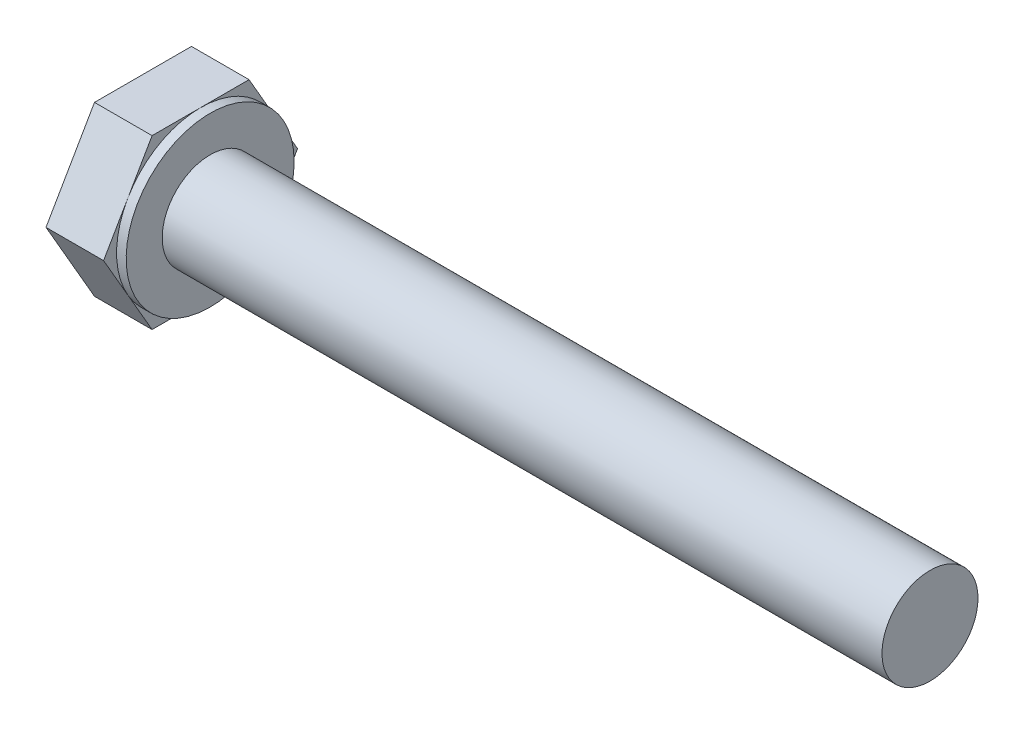
ISO-10303-21;
HEADER;
FILE_DESCRIPTION(('STEP AP214'),'2;1');
FILE_NAME('part.step','',(''),(''),'','','');
FILE_SCHEMA(('AUTOMOTIVE_DESIGN { 1 0 10303 214 1 1 1 1 }'));
ENDSEC;
DATA;
#1=APPLICATION_CONTEXT('core data for automotive mechanical design processes');
#2=APPLICATION_PROTOCOL_DEFINITION('international standard','automotive_design',2000,#1);
#3=PRODUCT_CONTEXT('',#1,'mechanical');
#4=PRODUCT('Part','Part','',(#3));
#5=PRODUCT_RELATED_PRODUCT_CATEGORY('part','',(#4));
#6=PRODUCT_DEFINITION_FORMATION('','',#4);
#7=PRODUCT_DEFINITION_CONTEXT('part definition',#1,'design');
#8=PRODUCT_DEFINITION('design','',#6,#7);
#9=PRODUCT_DEFINITION_SHAPE('','',#8);
#10=(LENGTH_UNIT() NAMED_UNIT(*) SI_UNIT(.MILLI.,.METRE.));
#11=(NAMED_UNIT(*) PLANE_ANGLE_UNIT() SI_UNIT($,.RADIAN.));
#12=(NAMED_UNIT(*) SI_UNIT($,.STERADIAN.) SOLID_ANGLE_UNIT());
#13=UNCERTAINTY_MEASURE_WITH_UNIT(LENGTH_MEASURE(1.E-05),#10,'distance_accuracy_value','');
#14=(GEOMETRIC_REPRESENTATION_CONTEXT(3) GLOBAL_UNCERTAINTY_ASSIGNED_CONTEXT((#13)) GLOBAL_UNIT_ASSIGNED_CONTEXT((#10,
#11,#12)) REPRESENTATION_CONTEXT('',''));
#15=CARTESIAN_POINT('',(0.,0.,0.));
#16=DIRECTION('',(0.,0.,1.));
#17=DIRECTION('',(1.,0.,0.));
#18=AXIS2_PLACEMENT_3D('',#15,#16,#17);
#19=CARTESIAN_POINT('',(0.4,0.,0.));
#20=DIRECTION('',(1.,0.,0.));
#21=DIRECTION('',(0.,0.,-1.));
#22=AXIS2_PLACEMENT_3D('',#19,#20,#21);
#23=PLANE('',#22);
#24=CARTESIAN_POINT('',(0.4,0.,0.));
#25=DIRECTION('',(1.,0.,0.));
#26=DIRECTION('',(0.,0.,-1.));
#27=AXIS2_PLACEMENT_3D('',#24,#25,#26);
#28=CIRCLE('',#27,3.5);
#29=CARTESIAN_POINT('',(0.4,0.,-3.5));
#30=VERTEX_POINT('',#29);
#31=EDGE_CURVE('E126',#30,#30,#28,.T.);
#32=ORIENTED_EDGE('',*,*,#31,.T.);
#33=EDGE_LOOP('',(#32));
#34=FACE_BOUND('',#33,.T.);
#35=CARTESIAN_POINT('',(0.4,0.,0.));
#36=DIRECTION('',(1.,0.,0.));
#37=DIRECTION('',(0.,0.,-1.));
#38=AXIS2_PLACEMENT_3D('',#35,#36,#37);
#39=CIRCLE('',#38,2.);
#40=CARTESIAN_POINT('',(0.4,0.,-2.));
#41=VERTEX_POINT('',#40);
#42=EDGE_CURVE('E349',#41,#41,#39,.T.);
#43=ORIENTED_EDGE('',*,*,#42,.F.);
#44=EDGE_LOOP('',(#43));
#45=FACE_BOUND('',#44,.T.);
#46=ADVANCED_FACE('F33',(#34,#45),#23,.T.);
#47=CARTESIAN_POINT('',(0.,0.,0.));
#48=DIRECTION('',(1.,0.,0.));
#49=DIRECTION('',(0.,0.,-1.));
#50=AXIS2_PLACEMENT_3D('',#47,#48,#49);
#51=PLANE('',#50);
#52=CARTESIAN_POINT('',(0.,0.,0.));
#53=DIRECTION('',(1.,0.,0.));
#54=DIRECTION('',(0.,0.,-1.));
#55=AXIS2_PLACEMENT_3D('',#52,#53,#54);
#56=CIRCLE('',#55,3.5);
#57=CARTESIAN_POINT('',(0.,1.75,-3.03108891324554));
#58=VERTEX_POINT('',#57);
#59=CARTESIAN_POINT('',(0.,3.5,0.));
#60=VERTEX_POINT('',#59);
#61=EDGE_CURVE('E44',#58,#60,#56,.T.);
#62=ORIENTED_EDGE('',*,*,#61,.F.);
#63=DIRECTION('',(0.,0.866025403784439,0.5));
#64=VECTOR('',#63,1.);
#65=CARTESIAN_POINT('',(0.,0.,-4.04145188432738));
#66=LINE('',#65,#64);
#67=CARTESIAN_POINT('',(0.,3.5,-2.02072594216369));
#68=VERTEX_POINT('',#67);
#69=EDGE_CURVE('E111',#58,#68,#66,.T.);
#70=ORIENTED_EDGE('',*,*,#69,.T.);
#71=DIRECTION('',(0.,0.,1.));
#72=VECTOR('',#71,1.);
#73=CARTESIAN_POINT('',(0.,3.5,-2.02072594216369));
#74=LINE('',#73,#72);
#75=EDGE_CURVE('E124',#68,#60,#74,.T.);
#76=ORIENTED_EDGE('',*,*,#75,.T.);
#77=EDGE_LOOP('',(#62,#70,#76));
#78=FACE_BOUND('',#77,.T.);
#79=ADVANCED_FACE('F123',(#78),#51,.T.);
#80=CARTESIAN_POINT('',(0.,1.75,3.03108891324554));
#81=VERTEX_POINT('',#80);
#82=EDGE_CURVE('E11',#60,#81,#56,.T.);
#83=ORIENTED_EDGE('',*,*,#82,.F.);
#84=CARTESIAN_POINT('',(0.,3.5,2.02072594216369));
#85=VERTEX_POINT('',#84);
#86=EDGE_CURVE('E110',#60,#85,#74,.T.);
#87=ORIENTED_EDGE('',*,*,#86,.T.);
#88=DIRECTION('',(0.,-0.866025403784439,0.5));
#89=VECTOR('',#88,1.);
#90=CARTESIAN_POINT('',(0.,3.5,2.02072594216369));
#91=LINE('',#90,#89);
#92=EDGE_CURVE('E156',#85,#81,#91,.T.);
#93=ORIENTED_EDGE('',*,*,#92,.T.);
#94=EDGE_LOOP('',(#83,#87,#93));
#95=FACE_BOUND('',#94,.T.);
#96=ADVANCED_FACE('F209',(#95),#51,.T.);
#97=CARTESIAN_POINT('',(0.,-1.75,3.03108891324554));
#98=VERTEX_POINT('',#97);
#99=EDGE_CURVE('E42',#81,#98,#56,.T.);
#100=ORIENTED_EDGE('',*,*,#99,.F.);
#101=CARTESIAN_POINT('',(0.,0.,4.04145188432738));
#102=VERTEX_POINT('',#101);
#103=EDGE_CURVE('E159',#81,#102,#91,.T.);
#104=ORIENTED_EDGE('',*,*,#103,.T.);
#105=DIRECTION('',(0.,-0.866025403784439,-0.5));
#106=VECTOR('',#105,1.);
#107=CARTESIAN_POINT('',(0.,0.,4.04145188432738));
#108=LINE('',#107,#106);
#109=EDGE_CURVE('E160',#102,#98,#108,.T.);
#110=ORIENTED_EDGE('',*,*,#109,.T.);
#111=EDGE_LOOP('',(#100,#104,#110));
#112=FACE_BOUND('',#111,.T.);
#113=ADVANCED_FACE('F190',(#112),#51,.T.);
#114=CARTESIAN_POINT('',(0.,-3.5,0.));
#115=VERTEX_POINT('',#114);
#116=EDGE_CURVE('E133',#98,#115,#56,.T.);
#117=ORIENTED_EDGE('',*,*,#116,.F.);
#118=CARTESIAN_POINT('',(0.,-3.5,2.02072594216369));
#119=VERTEX_POINT('',#118);
#120=EDGE_CURVE('E158',#98,#119,#108,.T.);
#121=ORIENTED_EDGE('',*,*,#120,.T.);
#122=DIRECTION('',(0.,0.,-1.));
#123=VECTOR('',#122,1.);
#124=CARTESIAN_POINT('',(0.,-3.5,2.02072594216369));
#125=LINE('',#124,#123);
#126=EDGE_CURVE('E164',#119,#115,#125,.T.);
#127=ORIENTED_EDGE('',*,*,#126,.T.);
#128=EDGE_LOOP('',(#117,#121,#127));
#129=FACE_BOUND('',#128,.T.);
#130=ADVANCED_FACE('F192',(#129),#51,.T.);
#131=CARTESIAN_POINT('',(0.,-1.75,-3.03108891324553));
#132=VERTEX_POINT('',#131);
#133=EDGE_CURVE('E131',#115,#132,#56,.T.);
#134=ORIENTED_EDGE('',*,*,#133,.F.);
#135=CARTESIAN_POINT('',(0.,-3.5,-2.02072594216369));
#136=VERTEX_POINT('',#135);
#137=EDGE_CURVE('E163',#115,#136,#125,.T.);
#138=ORIENTED_EDGE('',*,*,#137,.T.);
#139=DIRECTION('',(0.,0.866025403784439,-0.5));
#140=VECTOR('',#139,1.);
#141=CARTESIAN_POINT('',(0.,-3.5,-2.02072594216369));
#142=LINE('',#141,#140);
#143=EDGE_CURVE('E121',#136,#132,#142,.T.);
#144=ORIENTED_EDGE('',*,*,#143,.T.);
#145=EDGE_LOOP('',(#134,#138,#144));
#146=FACE_BOUND('',#145,.T.);
#147=ADVANCED_FACE('F199',(#146),#51,.T.);
#148=CARTESIAN_POINT('',(-2.4,3.5,2.02072594216369));
#149=DIRECTION('',(0.,0.5,0.866025403784439));
#150=DIRECTION('',(0.,-0.866025403784439,0.5));
#151=AXIS2_PLACEMENT_3D('',#148,#149,#150);
#152=PLANE('',#151);
#153=ORIENTED_EDGE('',*,*,#92,.F.);
#154=DIRECTION('',(1.,0.,0.));
#155=VECTOR('',#154,1.);
#156=CARTESIAN_POINT('',(-2.4,3.5,2.02072594216369));
#157=LINE('',#156,#155);
#158=CARTESIAN_POINT('',(-2.4,3.5,2.02072594216369));
#159=VERTEX_POINT('',#158);
#160=EDGE_CURVE('E132',#159,#85,#157,.T.);
#161=ORIENTED_EDGE('',*,*,#160,.F.);
#162=DIRECTION('',(0.,-0.866025403784439,0.5));
#163=VECTOR('',#162,1.);
#164=CARTESIAN_POINT('',(-2.4,3.5,2.02072594216369));
#165=LINE('',#164,#163);
#166=CARTESIAN_POINT('',(-2.4,0.,4.04145188432738));
#167=VERTEX_POINT('',#166);
#168=EDGE_CURVE('E139',#159,#167,#165,.T.);
#169=ORIENTED_EDGE('',*,*,#168,.T.);
#170=DIRECTION('',(1.,0.,0.));
#171=VECTOR('',#170,1.);
#172=CARTESIAN_POINT('',(-2.4,0.,4.04145188432738));
#173=LINE('',#172,#171);
#174=EDGE_CURVE('E37',#167,#102,#173,.T.);
#175=ORIENTED_EDGE('',*,*,#174,.T.);
#176=ORIENTED_EDGE('',*,*,#103,.F.);
#177=EDGE_LOOP('',(#153,#161,#169,#175,#176));
#178=FACE_BOUND('',#177,.T.);
#179=ADVANCED_FACE('F35',(#178),#152,.T.);
#180=CARTESIAN_POINT('',(-2.4,3.5,-2.02072594216369));
#181=DIRECTION('',(0.,1.,0.));
#182=DIRECTION('',(0.,0.,1.));
#183=AXIS2_PLACEMENT_3D('',#180,#181,#182);
#184=PLANE('',#183);
#185=ORIENTED_EDGE('',*,*,#75,.F.);
#186=DIRECTION('',(1.,0.,0.));
#187=VECTOR('',#186,1.);
#188=CARTESIAN_POINT('',(-2.4,3.5,-2.02072594216369));
#189=LINE('',#188,#187);
#190=CARTESIAN_POINT('',(-2.4,3.5,-2.02072594216369));
#191=VERTEX_POINT('',#190);
#192=EDGE_CURVE('E117',#191,#68,#189,.T.);
#193=ORIENTED_EDGE('',*,*,#192,.F.);
#194=DIRECTION('',(0.,0.,1.));
#195=VECTOR('',#194,1.);
#196=CARTESIAN_POINT('',(-2.4,3.5,-2.02072594216369));
#197=LINE('',#196,#195);
#198=EDGE_CURVE('E153',#191,#159,#197,.T.);
#199=ORIENTED_EDGE('',*,*,#198,.T.);
#200=ORIENTED_EDGE('',*,*,#160,.T.);
#201=ORIENTED_EDGE('',*,*,#86,.F.);
#202=EDGE_LOOP('',(#185,#193,#199,#200,#201));
#203=FACE_BOUND('',#202,.T.);
#204=ADVANCED_FACE('F208',(#203),#184,.T.);
#205=CARTESIAN_POINT('',(-2.4,0.,-4.04145188432738));
#206=DIRECTION('',(0.,0.5,-0.866025403784439));
#207=DIRECTION('',(0.,0.866025403784439,0.5));
#208=AXIS2_PLACEMENT_3D('',#205,#206,#207);
#209=PLANE('',#208);
#210=CARTESIAN_POINT('',(0.,0.,-4.04145188432738));
#211=VERTEX_POINT('',#210);
#212=EDGE_CURVE('E104',#211,#58,#66,.T.);
#213=ORIENTED_EDGE('',*,*,#212,.F.);
#214=DIRECTION('',(1.,0.,0.));
#215=VECTOR('',#214,1.);
#216=CARTESIAN_POINT('',(-2.4,0.,-4.04145188432738));
#217=LINE('',#216,#215);
#218=CARTESIAN_POINT('',(-2.4,0.,-4.04145188432738));
#219=VERTEX_POINT('',#218);
#220=EDGE_CURVE('E171',#219,#211,#217,.T.);
#221=ORIENTED_EDGE('',*,*,#220,.F.);
#222=DIRECTION('',(0.,0.866025403784439,0.5));
#223=VECTOR('',#222,1.);
#224=CARTESIAN_POINT('',(-2.4,0.,-4.04145188432738));
#225=LINE('',#224,#223);
#226=EDGE_CURVE('E151',#219,#191,#225,.T.);
#227=ORIENTED_EDGE('',*,*,#226,.T.);
#228=ORIENTED_EDGE('',*,*,#192,.T.);
#229=ORIENTED_EDGE('',*,*,#69,.F.);
#230=EDGE_LOOP('',(#213,#221,#227,#228,#229));
#231=FACE_BOUND('',#230,.T.);
#232=ADVANCED_FACE('F115',(#231),#209,.T.);
#233=CARTESIAN_POINT('',(-2.4,-3.5,-2.02072594216369));
#234=DIRECTION('',(0.,-0.5,-0.866025403784439));
#235=DIRECTION('',(0.,0.866025403784439,-0.5));
#236=AXIS2_PLACEMENT_3D('',#233,#234,#235);
#237=PLANE('',#236);
#238=ORIENTED_EDGE('',*,*,#143,.F.);
#239=DIRECTION('',(1.,0.,0.));
#240=VECTOR('',#239,1.);
#241=CARTESIAN_POINT('',(-2.4,-3.5,-2.02072594216369));
#242=LINE('',#241,#240);
#243=CARTESIAN_POINT('',(-2.4,-3.5,-2.02072594216369));
#244=VERTEX_POINT('',#243);
#245=EDGE_CURVE('E173',#244,#136,#242,.T.);
#246=ORIENTED_EDGE('',*,*,#245,.F.);
#247=DIRECTION('',(0.,0.866025403784439,-0.5));
#248=VECTOR('',#247,1.);
#249=CARTESIAN_POINT('',(-2.4,-3.5,-2.02072594216369));
#250=LINE('',#249,#248);
#251=EDGE_CURVE('E148',#244,#219,#250,.T.);
#252=ORIENTED_EDGE('',*,*,#251,.T.);
#253=ORIENTED_EDGE('',*,*,#220,.T.);
#254=EDGE_CURVE('E107',#132,#211,#142,.T.);
#255=ORIENTED_EDGE('',*,*,#254,.F.);
#256=EDGE_LOOP('',(#238,#246,#252,#253,#255));
#257=FACE_BOUND('',#256,.T.);
#258=ADVANCED_FACE('F201',(#257),#237,.T.);
#259=CARTESIAN_POINT('',(-2.4,-3.5,2.02072594216369));
#260=DIRECTION('',(0.,-1.,0.));
#261=DIRECTION('',(0.,0.,-1.));
#262=AXIS2_PLACEMENT_3D('',#259,#260,#261);
#263=PLANE('',#262);
#264=ORIENTED_EDGE('',*,*,#126,.F.);
#265=DIRECTION('',(1.,0.,0.));
#266=VECTOR('',#265,1.);
#267=CARTESIAN_POINT('',(-2.4,-3.5,2.02072594216369));
#268=LINE('',#267,#266);
#269=CARTESIAN_POINT('',(-2.4,-3.5,2.02072594216369));
#270=VERTEX_POINT('',#269);
#271=EDGE_CURVE('E175',#270,#119,#268,.T.);
#272=ORIENTED_EDGE('',*,*,#271,.F.);
#273=DIRECTION('',(0.,0.,-1.));
#274=VECTOR('',#273,1.);
#275=CARTESIAN_POINT('',(-2.4,-3.5,2.02072594216369));
#276=LINE('',#275,#274);
#277=EDGE_CURVE('E145',#270,#244,#276,.T.);
#278=ORIENTED_EDGE('',*,*,#277,.T.);
#279=ORIENTED_EDGE('',*,*,#245,.T.);
#280=ORIENTED_EDGE('',*,*,#137,.F.);
#281=EDGE_LOOP('',(#264,#272,#278,#279,#280));
#282=FACE_BOUND('',#281,.T.);
#283=ADVANCED_FACE('F195',(#282),#263,.T.);
#284=CARTESIAN_POINT('',(-2.4,0.,4.04145188432738));
#285=DIRECTION('',(0.,-0.5,0.866025403784439));
#286=DIRECTION('',(0.,-0.866025403784439,-0.5));
#287=AXIS2_PLACEMENT_3D('',#284,#285,#286);
#288=PLANE('',#287);
#289=ORIENTED_EDGE('',*,*,#109,.F.);
#290=ORIENTED_EDGE('',*,*,#174,.F.);
#291=DIRECTION('',(0.,-0.866025403784439,-0.5));
#292=VECTOR('',#291,1.);
#293=CARTESIAN_POINT('',(-2.4,0.,4.04145188432738));
#294=LINE('',#293,#292);
#295=EDGE_CURVE('E142',#167,#270,#294,.T.);
#296=ORIENTED_EDGE('',*,*,#295,.T.);
#297=ORIENTED_EDGE('',*,*,#271,.T.);
#298=ORIENTED_EDGE('',*,*,#120,.F.);
#299=EDGE_LOOP('',(#289,#290,#296,#297,#298));
#300=FACE_BOUND('',#299,.T.);
#301=ADVANCED_FACE('F187',(#300),#288,.T.);
#302=CARTESIAN_POINT('',(-2.4,0.,0.));
#303=DIRECTION('',(1.,0.,0.));
#304=DIRECTION('',(0.,0.,-1.));
#305=AXIS2_PLACEMENT_3D('',#302,#303,#304);
#306=PLANE('',#305);
#307=ORIENTED_EDGE('',*,*,#168,.F.);
#308=ORIENTED_EDGE('',*,*,#198,.F.);
#309=ORIENTED_EDGE('',*,*,#226,.F.);
#310=ORIENTED_EDGE('',*,*,#251,.F.);
#311=ORIENTED_EDGE('',*,*,#277,.F.);
#312=ORIENTED_EDGE('',*,*,#295,.F.);
#313=EDGE_LOOP('',(#307,#308,#309,#310,#311,#312));
#314=FACE_BOUND('',#313,.T.);
#315=ADVANCED_FACE('F206',(#314),#306,.F.);
#316=EDGE_CURVE('E57',#132,#58,#56,.T.);
#317=ORIENTED_EDGE('',*,*,#316,.F.);
#318=ORIENTED_EDGE('',*,*,#254,.T.);
#319=ORIENTED_EDGE('',*,*,#212,.T.);
#320=EDGE_LOOP('',(#317,#318,#319));
#321=FACE_BOUND('',#320,.T.);
#322=ADVANCED_FACE('F106',(#321),#51,.T.);
#323=CARTESIAN_POINT('',(0.4,0.,0.));
#324=DIRECTION('',(-1.,0.,0.));
#325=DIRECTION('',(0.,0.,1.));
#326=AXIS2_PLACEMENT_3D('',#323,#324,#325);
#327=CYLINDRICAL_SURFACE('',#326,3.5);
#328=ORIENTED_EDGE('',*,*,#31,.F.);
#329=EDGE_LOOP('',(#328));
#330=FACE_BOUND('',#329,.T.);
#331=ORIENTED_EDGE('',*,*,#61,.T.);
#332=ORIENTED_EDGE('',*,*,#82,.T.);
#333=ORIENTED_EDGE('',*,*,#99,.T.);
#334=ORIENTED_EDGE('',*,*,#116,.T.);
#335=ORIENTED_EDGE('',*,*,#133,.T.);
#336=ORIENTED_EDGE('',*,*,#316,.T.);
#337=EDGE_LOOP('',(#331,#332,#333,#334,#335,#336));
#338=FACE_BOUND('',#337,.T.);
#339=ADVANCED_FACE('F129',(#330,#338),#327,.T.);
#340=CARTESIAN_POINT('',(30.4,0.,0.));
#341=DIRECTION('',(-1.,0.,0.));
#342=DIRECTION('',(0.,0.,1.));
#343=AXIS2_PLACEMENT_3D('',#340,#341,#342);
#344=CYLINDRICAL_SURFACE('',#343,2.);
#345=CARTESIAN_POINT('',(30.4,0.,0.));
#346=DIRECTION('',(1.,0.,0.));
#347=DIRECTION('',(0.,0.,-1.));
#348=AXIS2_PLACEMENT_3D('',#345,#346,#347);
#349=CIRCLE('',#348,2.);
#350=CARTESIAN_POINT('',(30.4,0.,-2.));
#351=VERTEX_POINT('',#350);
#352=EDGE_CURVE('E127',#351,#351,#349,.T.);
#353=ORIENTED_EDGE('',*,*,#352,.F.);
#354=EDGE_LOOP('',(#353));
#355=FACE_BOUND('',#354,.T.);
#356=ORIENTED_EDGE('',*,*,#42,.T.);
#357=EDGE_LOOP('',(#356));
#358=FACE_BOUND('',#357,.T.);
#359=ADVANCED_FACE('F227',(#355,#358),#344,.T.);
#360=CARTESIAN_POINT('',(30.4,0.,0.));
#361=DIRECTION('',(1.,0.,0.));
#362=DIRECTION('',(0.,0.,-1.));
#363=AXIS2_PLACEMENT_3D('',#360,#361,#362);
#364=PLANE('',#363);
#365=ORIENTED_EDGE('',*,*,#352,.T.);
#366=EDGE_LOOP('',(#365));
#367=FACE_BOUND('',#366,.T.);
#368=ADVANCED_FACE('F335',(#367),#364,.T.);
#369=CLOSED_SHELL('',(#46,#79,#96,#113,#130,#147,#179,#204,#232,#258,#283,#301,#315,#322,#339,
#359,#368));
#370=MANIFOLD_SOLID_BREP('B2',#369);
#371=ADVANCED_BREP_SHAPE_REPRESENTATION('',(#18,#370),#14);
#372=SHAPE_DEFINITION_REPRESENTATION(#9,#371);
ENDSEC;
END-ISO-10303-21;
